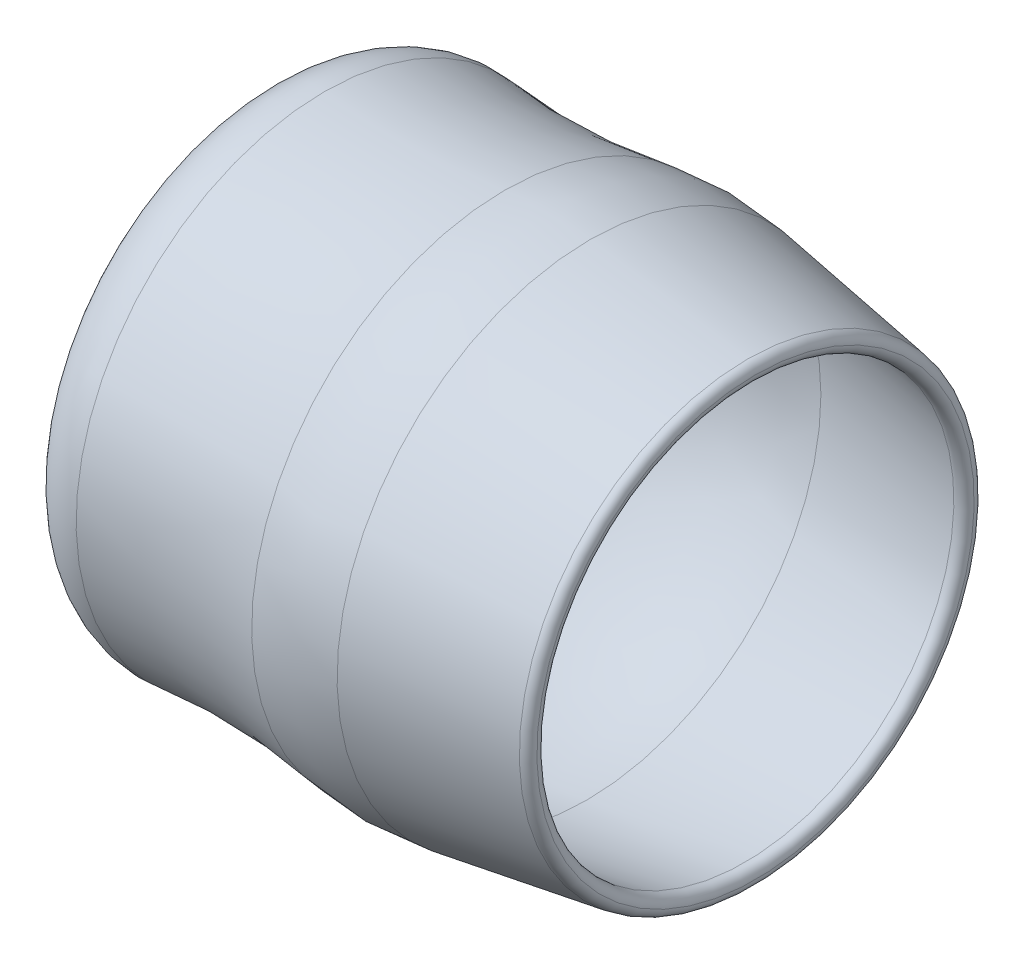
ISO-10303-21;
HEADER;
FILE_DESCRIPTION(('STEP AP214'),'2;1');
FILE_NAME('part.step','',(''),(''),'','','');
FILE_SCHEMA(('AUTOMOTIVE_DESIGN { 1 0 10303 214 1 1 1 1 }'));
ENDSEC;
DATA;
#1=APPLICATION_CONTEXT('core data for automotive mechanical design processes');
#2=APPLICATION_PROTOCOL_DEFINITION('international standard','automotive_design',2000,#1);
#3=PRODUCT_CONTEXT('',#1,'mechanical');
#4=PRODUCT('Part','Part','',(#3));
#5=PRODUCT_RELATED_PRODUCT_CATEGORY('part','',(#4));
#6=PRODUCT_DEFINITION_FORMATION('','',#4);
#7=PRODUCT_DEFINITION_CONTEXT('part definition',#1,'design');
#8=PRODUCT_DEFINITION('design','',#6,#7);
#9=PRODUCT_DEFINITION_SHAPE('','',#8);
#10=(LENGTH_UNIT() NAMED_UNIT(*) SI_UNIT(.MILLI.,.METRE.));
#11=(NAMED_UNIT(*) PLANE_ANGLE_UNIT() SI_UNIT($,.RADIAN.));
#12=(NAMED_UNIT(*) SI_UNIT($,.STERADIAN.) SOLID_ANGLE_UNIT());
#13=UNCERTAINTY_MEASURE_WITH_UNIT(LENGTH_MEASURE(1.E-05),#10,'distance_accuracy_value','');
#14=(GEOMETRIC_REPRESENTATION_CONTEXT(3) GLOBAL_UNCERTAINTY_ASSIGNED_CONTEXT((#13)) GLOBAL_UNIT_ASSIGNED_CONTEXT((#10,
#11,#12)) REPRESENTATION_CONTEXT('',''));
#15=CARTESIAN_POINT('',(0.,0.,0.));
#16=DIRECTION('',(0.,0.,1.));
#17=DIRECTION('',(1.,0.,0.));
#18=AXIS2_PLACEMENT_3D('',#15,#16,#17);
#19=CARTESIAN_POINT('',(-73.6011238405397,-5.64973336047227,0.));
#20=DIRECTION('',(1.,0.,0.));
#21=DIRECTION('',(0.,-1.,0.));
#22=AXIS2_PLACEMENT_3D('',#19,#20,#21);
#23=SPHERICAL_SURFACE('',#22,12.5000000000001);
#24=CARTESIAN_POINT('',(-71.4788024119683,-5.64973336047234,0.));
#25=DIRECTION('',(1.,0.,0.));
#26=DIRECTION('',(0.,1.,0.));
#27=AXIS2_PLACEMENT_3D('',#24,#25,#26);
#28=CIRCLE('',#27,12.3185125625553);
#29=CARTESIAN_POINT('',(-71.4788024119683,6.66877920208292,0.));
#30=VERTEX_POINT('',#29);
#31=EDGE_CURVE('E46',#30,#30,#28,.T.);
#32=ORIENTED_EDGE('',*,*,#31,.T.);
#33=EDGE_LOOP('',(#32));
#34=FACE_BOUND('',#33,.T.);
#35=ADVANCED_FACE('F34',(#34),#23,.F.);
#36=CARTESIAN_POINT('',(-20.5430881262538,-5.64973336047231,0.));
#37=DIRECTION('',(1.,0.,0.));
#38=DIRECTION('',(0.,1.,0.));
#39=AXIS2_PLACEMENT_3D('',#36,#37,#38);
#40=TOROIDAL_SURFACE('',#39,307.962814063876,300.);
#41=CARTESIAN_POINT('',(-63.1721723141863,-5.64973336047233,0.));
#42=DIRECTION('',(1.,0.,0.));
#43=DIRECTION('',(0.,1.,0.));
#44=AXIS2_PLACEMENT_3D('',#41,#42,#43);
#45=CIRCLE('',#44,11.0069904447762);
#46=CARTESIAN_POINT('',(-63.1721723141863,5.35725708430382,0.));
#47=VERTEX_POINT('',#46);
#48=EDGE_CURVE('E42',#47,#47,#45,.T.);
#49=ORIENTED_EDGE('',*,*,#48,.T.);
#50=EDGE_LOOP('',(#49));
#51=FACE_BOUND('',#50,.T.);
#52=ORIENTED_EDGE('',*,*,#31,.F.);
#53=EDGE_LOOP('',(#52));
#54=FACE_BOUND('',#53,.T.);
#55=ADVANCED_FACE('F81',(#51,#54),#40,.T.);
#56=CARTESIAN_POINT('',(-20.5430881262538,-5.64973336047231,0.));
#57=DIRECTION('',(1.,0.,0.));
#58=DIRECTION('',(0.,1.,0.));
#59=AXIS2_PLACEMENT_3D('',#56,#57,#58);
#60=TOROIDAL_SURFACE('',#59,307.962814063876,299.);
#61=CARTESIAN_POINT('',(-63.0300753668932,-5.64973336047233,0.));
#62=DIRECTION('',(1.,0.,0.));
#63=DIRECTION('',(0.,1.,0.));
#64=AXIS2_PLACEMENT_3D('',#61,#62,#63);
#65=CIRCLE('',#64,11.9968431901732);
#66=CARTESIAN_POINT('',(-63.0300753668932,6.34710982970082,0.));
#67=VERTEX_POINT('',#66);
#68=EDGE_CURVE('E10',#67,#67,#65,.F.);
#69=ORIENTED_EDGE('',*,*,#68,.T.);
#70=EDGE_LOOP('',(#69));
#71=FACE_BOUND('',#70,.T.);
#72=CARTESIAN_POINT('',(-71.3090166976825,-5.64973336047234,0.));
#73=DIRECTION('',(1.,0.,0.));
#74=DIRECTION('',(0.,1.,0.));
#75=AXIS2_PLACEMENT_3D('',#72,#73,#74);
#76=CIRCLE('',#75,13.3039935675596);
#77=CARTESIAN_POINT('',(-71.3090166976825,7.65426020708724,0.));
#78=VERTEX_POINT('',#77);
#79=EDGE_CURVE('E51',#78,#78,#76,.T.);
#80=ORIENTED_EDGE('',*,*,#79,.T.);
#81=EDGE_LOOP('',(#80));
#82=FACE_BOUND('',#81,.T.);
#83=ADVANCED_FACE('F87',(#71,#82),#60,.F.);
#84=CARTESIAN_POINT('',(-73.6011238405397,-5.64973336047227,0.));
#85=DIRECTION('',(1.,0.,0.));
#86=DIRECTION('',(0.,1.,0.));
#87=AXIS2_PLACEMENT_3D('',#84,#85,#86);
#88=SPHERICAL_SURFACE('',#87,13.5000000000001);
#89=CARTESIAN_POINT('',(-75.7846630442758,-5.64973336047235,0.));
#90=DIRECTION('',(1.,0.,0.));
#91=DIRECTION('',(0.,1.,0.));
#92=AXIS2_PLACEMENT_3D('',#89,#90,#91);
#93=CIRCLE('',#92,13.3222429247387);
#94=CARTESIAN_POINT('',(-75.7846630442758,7.67250956426639,0.));
#95=VERTEX_POINT('',#94);
#96=EDGE_CURVE('E54',#95,#95,#93,.T.);
#97=CARTESIAN_POINT('',(-75.7846630442758,7.67250956426639,0.));
#98=CARTESIAN_POINT('',(-75.7384418666098,7.68008530673437,0.));
#99=CARTESIAN_POINT('',(-75.6921812603833,7.68742048600698,0.));
#100=CARTESIAN_POINT('',(-75.5995862087282,7.70160896468208,0.));
#101=CARTESIAN_POINT('',(-75.5532517632996,7.70846226408457,0.));
#102=CARTESIAN_POINT('',(-75.4605140511588,7.72168622954011,0.));
#103=CARTESIAN_POINT('',(-75.4141107844467,7.72805689559316,0.));
#104=CARTESIAN_POINT('',(-75.3212404572568,7.74031490714427,0.));
#105=CARTESIAN_POINT('',(-75.274773396779,7.74620225264233,0.));
#106=CARTESIAN_POINT('',(-75.1817805159123,7.75749298449001,0.));
#107=CARTESIAN_POINT('',(-75.1352546955233,7.76289637083964,0.));
#108=CARTESIAN_POINT('',(-75.0421493352084,7.77321859923067,0.));
#109=CARTESIAN_POINT('',(-74.9955697952824,7.77813744127208,0.));
#110=CARTESIAN_POINT('',(-74.902362042046,7.78749004811058,0.));
#111=CARTESIAN_POINT('',(-74.8557338287355,7.79192381290766,0.));
#112=CARTESIAN_POINT('',(-74.7624337801668,7.80030578494398,0.));
#113=CARTESIAN_POINT('',(-74.7157619449085,7.80425399218322,0.));
#114=CARTESIAN_POINT('',(-74.6223797086034,7.81166442137355,0.));
#115=CARTESIAN_POINT('',(-74.5756693075567,7.81512664332465,0.));
#116=CARTESIAN_POINT('',(-74.4822150000129,7.82156472686244,0.));
#117=CARTESIAN_POINT('',(-74.4354710935159,7.82454058844914,0.));
#118=CARTESIAN_POINT('',(-74.3419548390393,7.83000562886999,0.));
#119=CARTESIAN_POINT('',(-74.2951824910598,7.83249480770416,0.));
#120=CARTESIAN_POINT('',(-74.2016144206673,7.8369862129566,0.));
#121=CARTESIAN_POINT('',(-74.1548186982542,7.83898843937489,0.));
#122=CARTESIAN_POINT('',(-74.061208948576,7.84250572288579,0.));
#123=CARTESIAN_POINT('',(-74.0143949213107,7.84402077997841,0.));
#124=CARTESIAN_POINT('',(-73.9207536334922,7.84656356070535,0.));
#125=CARTESIAN_POINT('',(-73.873926372939,7.84759128433968,0.));
#126=CARTESIAN_POINT('',(-73.7802636915426,7.84915928681233,0.));
#127=CARTESIAN_POINT('',(-73.7334282706993,7.84969956565065,0.));
#128=CARTESIAN_POINT('',(-73.6397543426048,7.85029262000057,0.));
#129=CARTESIAN_POINT('',(-73.5929158353535,7.85034539551217,0.));
#130=CARTESIAN_POINT('',(-73.4992408086591,7.84996343749124,0.));
#131=CARTESIAN_POINT('',(-73.452404289216,7.84952870395872,0.));
#132=CARTESIAN_POINT('',(-73.3587383121391,7.84817177494609,0.));
#133=CARTESIAN_POINT('',(-73.3119088545052,7.84724957946599,0.));
#134=CARTESIAN_POINT('',(-73.2182620742826,7.84491782646361,0.));
#135=CARTESIAN_POINT('',(-73.1714447516939,7.84350826894133,0.));
#136=CARTESIAN_POINT('',(-73.0778273134828,7.84020194455798,0.));
#137=CARTESIAN_POINT('',(-73.0310271978605,7.83830517769693,0.));
#138=CARTESIAN_POINT('',(-72.9374492436395,7.83402464012092,0.));
#139=CARTESIAN_POINT('',(-72.8906714050408,7.83164086940597,0.));
#140=CARTESIAN_POINT('',(-72.7971430725109,7.8263865823663,0.));
#141=CARTESIAN_POINT('',(-72.7503925785796,7.82351606604158,0.));
#142=CARTESIAN_POINT('',(-72.656924000066,7.81728859875764,0.));
#143=CARTESIAN_POINT('',(-72.6102059154837,7.81393164779841,0.));
#144=CARTESIAN_POINT('',(-72.5168072168383,7.80673167491864,0.));
#145=CARTESIAN_POINT('',(-72.4701266027752,7.80288865299809,0.));
#146=CARTESIAN_POINT('',(-72.3768079022796,7.79471695452562,0.));
#147=CARTESIAN_POINT('',(-72.330169815847,7.7903882779737,0.));
#148=CARTESIAN_POINT('',(-72.2369412231156,7.78124573918665,0.));
#149=CARTESIAN_POINT('',(-72.1903507168168,7.77643187695153,0.));
#150=CARTESIAN_POINT('',(-72.0972223317046,7.76631948828919,0.));
#151=CARTESIAN_POINT('',(-72.0506844528913,7.76102096186198,0.));
#152=CARTESIAN_POINT('',(-71.9576663643889,7.74993981888434,0.));
#153=CARTESIAN_POINT('',(-71.9111861546998,7.74415720233392,0.));
#154=CARTESIAN_POINT('',(-71.8182884398807,7.73210850535356,0.));
#155=CARTESIAN_POINT('',(-71.7718709347505,7.72584242492362,0.));
#156=CARTESIAN_POINT('',(-71.6791036575287,7.71282747980663,0.));
#157=CARTESIAN_POINT('',(-71.632753885437,7.70607861511957,0.));
#158=CARTESIAN_POINT('',(-71.5401270960387,7.69209882966956,0.));
#159=CARTESIAN_POINT('',(-71.493850078732,7.6848679089066,0.));
#160=CARTESIAN_POINT('',(-71.4013738105111,7.66992480567932,0.));
#161=CARTESIAN_POINT('',(-71.3551745595969,7.662212623215,0.));
#162=CARTESIAN_POINT('',(-71.3090166976825,7.65426020708724,0.));
#163=B_SPLINE_CURVE_WITH_KNOTS('',3,(#97,#98,#99,#100,#101,#102,#103,#104,#105,#106,#107,#108,
#109,#110,#111,#112,#113,#114,#115,#116,#117,#118,#119,#120,#121,#122,#123,#124,#125,#126,#127,
#128,#129,#130,#131,#132,#133,#134,#135,#136,#137,#138,#139,#140,#141,#142,#143,#144,#145,#146,
#147,#148,#149,#150,#151,#152,#153,#154,#155,#156,#157,#158,#159,#160,#161,#162),.UNSPECIFIED.,
.F.,.F.,(4,2,2,2,2,2,2,2,2,2,2,2,2,2,2,2,2,2,2,2,2,2,2,2,2,2,2,2,2,2,2,2,4),(0.,
0.140513073841744,0.28102614768349,0.421539221525236,0.562052295366967,0.702565369208713,
0.843078443050448,0.9835915168922,1.12410459073394,1.26461766457567,1.40513073841741,
1.54564381225916,1.68615688610091,1.82666995994263,1.96718303378439,2.10769610762612,
2.24820918146786,2.38872225530961,2.52923532915135,2.66974840299308,2.81026147683482,
2.95077455067658,3.09128762451831,3.23180069836005,3.37231377220179,3.51282684604353,
3.65333991988528,3.79385299372702,3.93436606756876,4.0748791414105,4.21539221525224,
4.35590528909399,4.49641836293573),.UNSPECIFIED.);
#164=EDGE_CURVE('BSEAM93',#95,#78,#163,.T.);
#165=ORIENTED_EDGE('',*,*,#96,.T.);
#166=ORIENTED_EDGE('',*,*,#79,.F.);
#167=ORIENTED_EDGE('',*,*,#164,.T.);
#168=ORIENTED_EDGE('',*,*,#164,.F.);
#169=EDGE_LOOP('',(#165,#167,#166,#168));
#170=FACE_BOUND('',#169,.T.);
#171=ADVANCED_FACE('F93',(#170),#88,.T.);
#172=CARTESIAN_POINT('',(-81.4456906095177,-5.64973336047235,0.));
#173=DIRECTION('',(1.,0.,0.));
#174=DIRECTION('',(0.,1.,0.));
#175=AXIS2_PLACEMENT_3D('',#172,#173,#174);
#176=TOROIDAL_SURFACE('',#175,47.8613912481351,35.);
#177=CARTESIAN_POINT('',(-85.2689157497582,-5.64973336047235,0.));
#178=DIRECTION('',(1.,0.,0.));
#179=DIRECTION('',(0.,1.,0.));
#180=AXIS2_PLACEMENT_3D('',#177,#178,#179);
#181=CIRCLE('',#180,13.0708329093122);
#182=CARTESIAN_POINT('',(-85.2689157497582,7.4210995488399,0.));
#183=VERTEX_POINT('',#182);
#184=EDGE_CURVE('E57',#183,#183,#181,.T.);
#185=ORIENTED_EDGE('',*,*,#184,.T.);
#186=EDGE_LOOP('',(#185));
#187=FACE_BOUND('',#186,.T.);
#188=ORIENTED_EDGE('',*,*,#96,.F.);
#189=EDGE_LOOP('',(#188));
#190=FACE_BOUND('',#189,.T.);
#191=ADVANCED_FACE('F96',(#187,#190),#176,.F.);
#192=CARTESIAN_POINT('',(-85.5966207617788,-5.64973336047235,0.));
#193=DIRECTION('',(1.,0.,0.));
#194=DIRECTION('',(0.,1.,0.));
#195=AXIS2_PLACEMENT_3D('',#192,#193,#194);
#196=TOROIDAL_SURFACE('',#195,10.0887850516989,3.);
#197=CARTESIAN_POINT('',(-88.5693545651808,-5.64973336047235,0.));
#198=DIRECTION('',(1.,0.,0.));
#199=DIRECTION('',(0.,1.,0.));
#200=AXIS2_PLACEMENT_3D('',#197,#198,#199);
#201=CIRCLE('',#200,10.4923364537668);
#202=CARTESIAN_POINT('',(-88.5693545651808,4.84260309329445,0.));
#203=VERTEX_POINT('',#202);
#204=EDGE_CURVE('E60',#203,#203,#201,.T.);
#205=ORIENTED_EDGE('',*,*,#204,.T.);
#206=EDGE_LOOP('',(#205));
#207=FACE_BOUND('',#206,.T.);
#208=ORIENTED_EDGE('',*,*,#184,.F.);
#209=EDGE_LOOP('',(#208));
#210=FACE_BOUND('',#209,.T.);
#211=ADVANCED_FACE('F77',(#207,#210),#196,.T.);
#212=CARTESIAN_POINT('',(-11.2782756767285,-5.64973336047226,0.));
#213=DIRECTION('',(1.,0.,0.));
#214=DIRECTION('',(0.,1.,0.));
#215=AXIS2_PLACEMENT_3D('',#212,#213,#214);
#216=SPHERICAL_SURFACE('',#215,78.);
#217=ORIENTED_EDGE('',*,*,#204,.F.);
#218=EDGE_LOOP('',(#217));
#219=FACE_BOUND('',#218,.T.);
#220=ADVANCED_FACE('F71',(#219),#216,.T.);
#221=CARTESIAN_POINT('',(-63.1011238405398,-5.64973336047233,0.));
#222=DIRECTION('',(-1.,0.,0.));
#223=DIRECTION('',(0.,-1.,0.));
#224=AXIS2_PLACEMENT_3D('',#221,#222,#223);
#225=TOROIDAL_SURFACE('',#224,11.5019168174747,0.5);
#226=ORIENTED_EDGE('',*,*,#68,.F.);
#227=EDGE_LOOP('',(#226));
#228=FACE_BOUND('',#227,.T.);
#229=CARTESIAN_POINT('',(-62.6011238405397,-5.64973336047233,0.));
#230=DIRECTION('',(1.,0.,0.));
#231=DIRECTION('',(0.,1.,0.));
#232=AXIS2_PLACEMENT_3D('',#229,#230,#231);
#233=CIRCLE('',#232,11.5019168174747);
#234=CARTESIAN_POINT('',(-62.6011238405398,5.85218345700236,0.));
#235=VERTEX_POINT('',#234);
#236=EDGE_CURVE('E38',#235,#235,#233,.T.);
#237=ORIENTED_EDGE('',*,*,#236,.F.);
#238=EDGE_LOOP('',(#237));
#239=FACE_BOUND('',#238,.T.);
#240=ADVANCED_FACE('F36',(#228,#239),#225,.T.);
#241=CARTESIAN_POINT('',(-63.1011238405398,-5.64973336047233,0.));
#242=DIRECTION('',(-1.,0.,0.));
#243=DIRECTION('',(0.,-1.,0.));
#244=AXIS2_PLACEMENT_3D('',#241,#242,#243);
#245=TOROIDAL_SURFACE('',#244,11.5019168174747,0.5);
#246=ORIENTED_EDGE('',*,*,#236,.T.);
#247=EDGE_LOOP('',(#246));
#248=FACE_BOUND('',#247,.T.);
#249=ORIENTED_EDGE('',*,*,#48,.F.);
#250=EDGE_LOOP('',(#249));
#251=FACE_BOUND('',#250,.T.);
#252=ADVANCED_FACE('F67',(#248,#251),#245,.T.);
#253=CLOSED_SHELL('',(#35,#55,#83,#171,#191,#211,#220,#240,#252));
#254=MANIFOLD_SOLID_BREP('B2',#253);
#255=ADVANCED_BREP_SHAPE_REPRESENTATION('',(#18,#254),#14);
#256=SHAPE_DEFINITION_REPRESENTATION(#9,#255);
ENDSEC;
END-ISO-10303-21;
